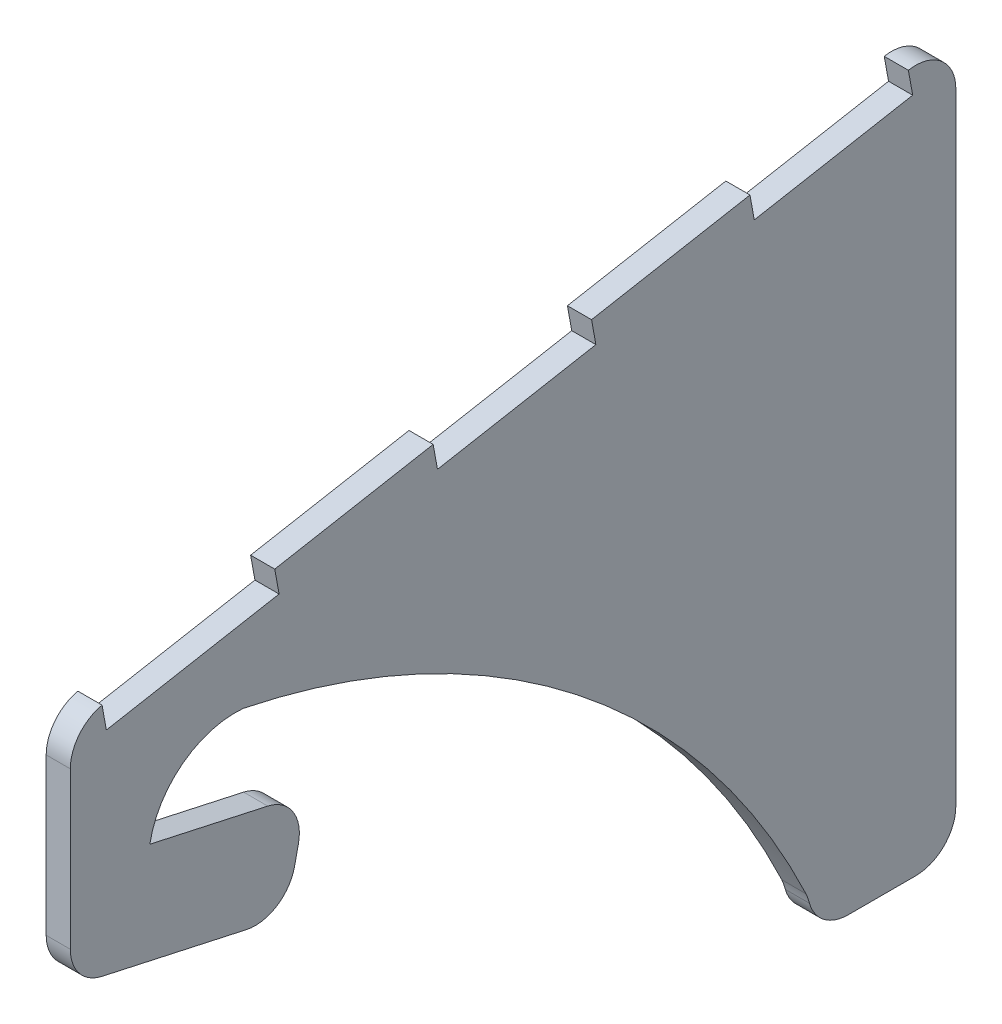
ISO-10303-21;
HEADER;
FILE_DESCRIPTION(('STEP AP214'),'2;1');
FILE_NAME('part.step','',(''),(''),'','','');
FILE_SCHEMA(('AUTOMOTIVE_DESIGN { 1 0 10303 214 1 1 1 1 }'));
ENDSEC;
DATA;
#1=APPLICATION_CONTEXT('core data for automotive mechanical design processes');
#2=APPLICATION_PROTOCOL_DEFINITION('international standard','automotive_design',2000,#1);
#3=PRODUCT_CONTEXT('',#1,'mechanical');
#4=PRODUCT('Part','Part','',(#3));
#5=PRODUCT_RELATED_PRODUCT_CATEGORY('part','',(#4));
#6=PRODUCT_DEFINITION_FORMATION('','',#4);
#7=PRODUCT_DEFINITION_CONTEXT('part definition',#1,'design');
#8=PRODUCT_DEFINITION('design','',#6,#7);
#9=PRODUCT_DEFINITION_SHAPE('','',#8);
#10=(LENGTH_UNIT() NAMED_UNIT(*) SI_UNIT(.MILLI.,.METRE.));
#11=(NAMED_UNIT(*) PLANE_ANGLE_UNIT() SI_UNIT($,.RADIAN.));
#12=(NAMED_UNIT(*) SI_UNIT($,.STERADIAN.) SOLID_ANGLE_UNIT());
#13=UNCERTAINTY_MEASURE_WITH_UNIT(LENGTH_MEASURE(1.E-05),#10,'distance_accuracy_value','');
#14=(GEOMETRIC_REPRESENTATION_CONTEXT(3) GLOBAL_UNCERTAINTY_ASSIGNED_CONTEXT((#13)) GLOBAL_UNIT_ASSIGNED_CONTEXT((#10,
#11,#12)) REPRESENTATION_CONTEXT('',''));
#15=CARTESIAN_POINT('',(0.,0.,0.));
#16=DIRECTION('',(0.,0.,1.));
#17=DIRECTION('',(1.,0.,0.));
#18=AXIS2_PLACEMENT_3D('',#15,#16,#17);
#19=CARTESIAN_POINT('',(-7.,-22.3926531414817,0.));
#20=DIRECTION('',(0.,-0.983869910099907,-0.178885438199983));
#21=DIRECTION('',(0.,0.178885438199983,-0.983869910099907));
#22=AXIS2_PLACEMENT_3D('',#19,#20,#21);
#23=PLANE('',#22);
#24=DIRECTION('',(0.,0.178885438199983,-0.983869910099907));
#25=VECTOR('',#24,1.);
#26=CARTESIAN_POINT('',(3.,-22.3926531414817,0.));
#27=LINE('',#26,#25);
#28=CARTESIAN_POINT('',(3.00000000000001,-10.6197847042083,-64.7507764050038));
#29=VERTEX_POINT('',#28);
#30=CARTESIAN_POINT('',(3.,-7.04207594020867,-84.4281746070019));
#31=VERTEX_POINT('',#30);
#32=EDGE_CURVE('E495',#29,#31,#27,.T.);
#33=ORIENTED_EDGE('',*,*,#32,.T.);
#34=DIRECTION('',(1.,0.,0.));
#35=VECTOR('',#34,1.);
#36=CARTESIAN_POINT('',(0.,-7.04207594020867,-84.4281746070019));
#37=LINE('',#36,#35);
#38=CARTESIAN_POINT('',(0.,-7.04207594020867,-84.4281746070019));
#39=VERTEX_POINT('',#38);
#40=EDGE_CURVE('E234',#39,#31,#37,.T.);
#41=ORIENTED_EDGE('',*,*,#40,.F.);
#42=DIRECTION('',(0.,0.178885438199983,-0.983869910099907));
#43=VECTOR('',#42,1.);
#44=CARTESIAN_POINT('',(0.,-21.6760882409543,-3.94110695290079));
#45=LINE('',#44,#43);
#46=CARTESIAN_POINT('',(0.,-10.6197847042083,-64.7507764050038));
#47=VERTEX_POINT('',#46);
#48=EDGE_CURVE('E240',#47,#39,#45,.T.);
#49=ORIENTED_EDGE('',*,*,#48,.F.);
#50=DIRECTION('',(-1.,0.,0.));
#51=VECTOR('',#50,1.);
#52=CARTESIAN_POINT('',(0.,-10.6197847042083,-64.7507764050038));
#53=LINE('',#52,#51);
#54=EDGE_CURVE('E253',#29,#47,#53,.T.);
#55=ORIENTED_EDGE('',*,*,#54,.F.);
#56=EDGE_LOOP('',(#33,#41,#49,#55));
#57=FACE_BOUND('',#56,.T.);
#58=ADVANCED_FACE('F37',(#57),#23,.F.);
#59=CARTESIAN_POINT('',(3.,0.,0.));
#60=DIRECTION('',(0.,0.,-1.));
#61=DIRECTION('',(0.,1.,0.));
#62=AXIS2_PLACEMENT_3D('',#59,#60,#61);
#63=PLANE('',#62);
#64=DIRECTION('',(0.,-1.,0.));
#65=VECTOR('',#64,1.);
#66=CARTESIAN_POINT('',(3.,0.,0.));
#67=LINE('',#66,#65);
#68=CARTESIAN_POINT('',(3.,-26.5655349085267,0.));
#69=VERTEX_POINT('',#68);
#70=CARTESIAN_POINT('',(3.,-45.9770603253843,0.));
#71=VERTEX_POINT('',#70);
#72=EDGE_CURVE('E369',#69,#71,#67,.T.);
#73=ORIENTED_EDGE('',*,*,#72,.F.);
#74=DIRECTION('',(1.,0.,0.));
#75=VECTOR('',#74,1.);
#76=CARTESIAN_POINT('',(3.,-26.5655349085267,0.));
#77=LINE('',#76,#75);
#78=CARTESIAN_POINT('',(0.,-26.5655349085267,0.));
#79=VERTEX_POINT('',#78);
#80=EDGE_CURVE('E45',#69,#79,#77,.F.);
#81=ORIENTED_EDGE('',*,*,#80,.T.);
#82=DIRECTION('',(0.,-1.,0.));
#83=VECTOR('',#82,1.);
#84=CARTESIAN_POINT('',(0.,0.,0.));
#85=LINE('',#84,#83);
#86=CARTESIAN_POINT('',(0.,-45.9770603253843,0.));
#87=VERTEX_POINT('',#86);
#88=EDGE_CURVE('E364',#79,#87,#85,.T.);
#89=ORIENTED_EDGE('',*,*,#88,.T.);
#90=DIRECTION('',(1.,0.,0.));
#91=VECTOR('',#90,1.);
#92=CARTESIAN_POINT('',(3.,-45.9770603253843,0.));
#93=LINE('',#92,#91);
#94=EDGE_CURVE('E411',#87,#71,#93,.T.);
#95=ORIENTED_EDGE('',*,*,#94,.T.);
#96=EDGE_LOOP('',(#73,#81,#89,#95));
#97=FACE_BOUND('',#96,.T.);
#98=ADVANCED_FACE('F410',(#97),#63,.F.);
#99=CARTESIAN_POINT('',(3.,0.,-110.));
#100=DIRECTION('',(0.,0.,1.));
#101=DIRECTION('',(0.,-1.,0.));
#102=AXIS2_PLACEMENT_3D('',#99,#100,#101);
#103=PLANE('',#102);
#104=DIRECTION('',(0.,1.,0.));
#105=VECTOR('',#104,1.);
#106=CARTESIAN_POINT('',(0.,0.,-110.));
#107=LINE('',#106,#105);
#108=CARTESIAN_POINT('',(0.,-85.5863037175349,-110.));
#109=VERTEX_POINT('',#108);
#110=CARTESIAN_POINT('',(0.,-8.38371672670854,-110.));
#111=VERTEX_POINT('',#110);
#112=EDGE_CURVE('E374',#109,#111,#107,.T.);
#113=ORIENTED_EDGE('',*,*,#112,.T.);
#114=DIRECTION('',(1.,0.,0.));
#115=VECTOR('',#114,1.);
#116=CARTESIAN_POINT('',(3.,-8.38371672670854,-110.));
#117=LINE('',#116,#115);
#118=CARTESIAN_POINT('',(3.,-8.38371672670854,-110.));
#119=VERTEX_POINT('',#118);
#120=EDGE_CURVE('E431',#111,#119,#117,.T.);
#121=ORIENTED_EDGE('',*,*,#120,.T.);
#122=DIRECTION('',(0.,1.,0.));
#123=VECTOR('',#122,1.);
#124=CARTESIAN_POINT('',(3.,0.,-110.));
#125=LINE('',#124,#123);
#126=CARTESIAN_POINT('',(3.,-85.5863037175349,-110.));
#127=VERTEX_POINT('',#126);
#128=EDGE_CURVE('E373',#127,#119,#125,.T.);
#129=ORIENTED_EDGE('',*,*,#128,.F.);
#130=DIRECTION('',(1.,0.,0.));
#131=VECTOR('',#130,1.);
#132=CARTESIAN_POINT('',(3.,-85.5863037175349,-110.));
#133=LINE('',#132,#131);
#134=EDGE_CURVE('E434',#127,#109,#133,.F.);
#135=ORIENTED_EDGE('',*,*,#134,.T.);
#136=EDGE_LOOP('',(#113,#121,#129,#135));
#137=FACE_BOUND('',#136,.T.);
#138=ADVANCED_FACE('F592',(#137),#103,.F.);
#139=CARTESIAN_POINT('',(3.,0.,0.));
#140=DIRECTION('',(1.,0.,0.));
#141=DIRECTION('',(0.,0.,-1.));
#142=AXIS2_PLACEMENT_3D('',#139,#140,#141);
#143=PLANE('',#142);
#144=DIRECTION('',(0.,0.983869910099907,0.178885438199983));
#145=VECTOR('',#144,1.);
#146=CARTESIAN_POINT('',(3.,-6.41597690650873,-104.6422291236));
#147=LINE('',#146,#145);
#148=CARTESIAN_POINT('',(3.,-6.41597690650873,-104.6422291236));
#149=VERTEX_POINT('',#148);
#150=CARTESIAN_POINT('',(3.,-3.46436717620901,-104.105572809));
#151=VERTEX_POINT('',#150);
#152=EDGE_CURVE('E243',#149,#151,#147,.T.);
#153=ORIENTED_EDGE('',*,*,#152,.F.);
#154=DIRECTION('',(0.,0.178885438199983,-0.983869910099908));
#155=VECTOR('',#154,1.);
#156=CARTESIAN_POINT('',(3.,-6.41597690650873,-104.6422291236));
#157=LINE('',#156,#155);
#158=CARTESIAN_POINT('',(3.,-9.9936856705084,-84.9648309216019));
#159=VERTEX_POINT('',#158);
#160=EDGE_CURVE('E224',#159,#149,#157,.T.);
#161=ORIENTED_EDGE('',*,*,#160,.F.);
#162=DIRECTION('',(0.,0.983869910099907,0.178885438199983));
#163=VECTOR('',#162,1.);
#164=CARTESIAN_POINT('',(3.,-9.9936856705084,-84.9648309216019));
#165=LINE('',#164,#163);
#166=EDGE_CURVE('E221',#159,#31,#165,.T.);
#167=ORIENTED_EDGE('',*,*,#166,.T.);
#168=ORIENTED_EDGE('',*,*,#32,.F.);
#169=DIRECTION('',(0.,0.983869910099907,0.178885438199983));
#170=VECTOR('',#169,1.);
#171=CARTESIAN_POINT('',(3.00000000000001,-13.5713944345081,-65.2874327196037));
#172=LINE('',#171,#170);
#173=CARTESIAN_POINT('',(3.00000000000001,-13.5713944345081,-65.2874327196037));
#174=VERTEX_POINT('',#173);
#175=EDGE_CURVE('E276',#174,#29,#172,.T.);
#176=ORIENTED_EDGE('',*,*,#175,.F.);
#177=DIRECTION('',(0.,0.178885438199983,-0.983869910099908));
#178=VECTOR('',#177,1.);
#179=CARTESIAN_POINT('',(3.00000000000001,-13.5713944345081,-65.2874327196037));
#180=LINE('',#179,#178);
#181=CARTESIAN_POINT('',(3.00000000000001,-17.1491031985077,-45.6100345176056));
#182=VERTEX_POINT('',#181);
#183=EDGE_CURVE('E256',#182,#174,#180,.T.);
#184=ORIENTED_EDGE('',*,*,#183,.F.);
#185=DIRECTION('',(0.,0.983869910099907,0.178885438199983));
#186=VECTOR('',#185,1.);
#187=CARTESIAN_POINT('',(3.00000000000001,-17.1491031985077,-45.6100345176056));
#188=LINE('',#187,#186);
#189=CARTESIAN_POINT('',(3.00000000000001,-14.197493468208,-45.0733782030056));
#190=VERTEX_POINT('',#189);
#191=EDGE_CURVE('E271',#182,#190,#188,.T.);
#192=ORIENTED_EDGE('',*,*,#191,.T.);
#193=CARTESIAN_POINT('',(3.00000000000002,-17.7752022322077,-25.3959800010075));
#194=VERTEX_POINT('',#193);
#195=EDGE_CURVE('E488',#194,#190,#27,.T.);
#196=ORIENTED_EDGE('',*,*,#195,.F.);
#197=DIRECTION('',(0.,0.983869910099907,0.178885438199983));
#198=VECTOR('',#197,1.);
#199=CARTESIAN_POINT('',(3.00000000000002,-20.7268119625074,-25.9326363156074));
#200=LINE('',#199,#198);
#201=CARTESIAN_POINT('',(3.00000000000002,-20.7268119625074,-25.9326363156074));
#202=VERTEX_POINT('',#201);
#203=EDGE_CURVE('E305',#202,#194,#200,.T.);
#204=ORIENTED_EDGE('',*,*,#203,.F.);
#205=DIRECTION('',(0.,0.178885438199983,-0.983869910099907));
#206=VECTOR('',#205,1.);
#207=CARTESIAN_POINT('',(3.,-24.6276979712541,-4.47776326750073));
#208=LINE('',#207,#206);
#209=CARTESIAN_POINT('',(3.,-24.6276979712541,-4.47776326750073));
#210=VERTEX_POINT('',#209);
#211=EDGE_CURVE('E287',#210,#202,#208,.T.);
#212=ORIENTED_EDGE('',*,*,#211,.F.);
#213=DIRECTION('',(0.,0.983869910099907,0.178885438199983));
#214=VECTOR('',#213,1.);
#215=CARTESIAN_POINT('',(3.,-24.6276979712541,-4.47776326750073));
#216=LINE('',#215,#214);
#217=CARTESIAN_POINT('',(3.,-21.6788382570015,-3.94160695581845));
#218=VERTEX_POINT('',#217);
#219=EDGE_CURVE('E300',#210,#218,#216,.T.);
#220=ORIENTED_EDGE('',*,*,#219,.T.);
#221=CARTESIAN_POINT('',(3.,-26.5655349085267,-5.));
#222=DIRECTION('',(1.,0.,0.));
#223=DIRECTION('',(0.,0.,-1.));
#224=AXIS2_PLACEMENT_3D('',#221,#222,#223);
#225=CIRCLE('',#224,5.);
#226=EDGE_CURVE('E328',#218,#69,#225,.T.);
#227=ORIENTED_EDGE('',*,*,#226,.T.);
#228=ORIENTED_EDGE('',*,*,#72,.T.);
#229=CARTESIAN_POINT('',(3.,-45.9770603253843,-5.00000000000001));
#230=DIRECTION('',(1.,0.,0.));
#231=DIRECTION('',(0.,0.,-1.));
#232=AXIS2_PLACEMENT_3D('',#229,#230,#231);
#233=CIRCLE('',#232,5.);
#234=CARTESIAN_POINT('',(3.,-50.8605717362818,-3.92700591817357));
#235=VERTEX_POINT('',#234);
#236=EDGE_CURVE('E377',#71,#235,#233,.T.);
#237=ORIENTED_EDGE('',*,*,#236,.T.);
#238=DIRECTION('',(0.,0.214598816365285,0.976702282179487));
#239=VECTOR('',#238,1.);
#240=CARTESIAN_POINT('',(3.,-55.8815219799871,-26.7788260949877));
#241=LINE('',#240,#239);
#242=CARTESIAN_POINT('',(3.,-54.8085278981607,-21.8953146840903));
#243=VERTEX_POINT('',#242);
#244=EDGE_CURVE('E530',#243,#235,#241,.T.);
#245=ORIENTED_EDGE('',*,*,#244,.F.);
#246=CARTESIAN_POINT('',(3.,-49.9250164872633,-22.9683087659167));
#247=DIRECTION('',(1.,0.,0.));
#248=DIRECTION('',(0.,0.,-1.));
#249=AXIS2_PLACEMENT_3D('',#246,#247,#248);
#250=CIRCLE('',#249,5.);
#251=CARTESIAN_POINT('',(3.,-50.9980105690897,-27.8518201768142));
#252=VERTEX_POINT('',#251);
#253=EDGE_CURVE('E338',#243,#252,#250,.T.);
#254=ORIENTED_EDGE('',*,*,#253,.T.);
#255=DIRECTION('',(0.,-0.976702282179487,0.214598816365285));
#256=VECTOR('',#255,1.);
#257=CARTESIAN_POINT('',(3.,-55.8815219799871,-26.7788260949877));
#258=LINE('',#257,#256);
#259=CARTESIAN_POINT('',(3.,-48.7905220180035,-28.3368445684291));
#260=VERTEX_POINT('',#259);
#261=EDGE_CURVE('E352',#260,#252,#258,.T.);
#262=ORIENTED_EDGE('',*,*,#261,.F.);
#263=CARTESIAN_POINT('',(3.,-47.7175279361771,-23.4533331575316));
#264=DIRECTION('',(1.,0.,0.));
#265=DIRECTION('',(0.,0.,-1.));
#266=AXIS2_PLACEMENT_3D('',#263,#264,#265);
#267=CIRCLE('',#266,5.);
#268=CARTESIAN_POINT('',(3.,-42.8340165252797,-24.5263272393581));
#269=VERTEX_POINT('',#268);
#270=EDGE_CURVE('E342',#260,#269,#267,.T.);
#271=ORIENTED_EDGE('',*,*,#270,.T.);
#272=DIRECTION('',(0.,-0.214598816365284,-0.976702282179487));
#273=VECTOR('',#272,1.);
#274=CARTESIAN_POINT('',(3.,-43.9070106071061,-29.4098386502555));
#275=LINE('',#274,#273);
#276=CARTESIAN_POINT('',(3.,-39.6150342798004,-9.87579300666575));
#277=VERTEX_POINT('',#276);
#278=EDGE_CURVE('E359',#277,#269,#275,.T.);
#279=ORIENTED_EDGE('',*,*,#278,.F.);
#280=CARTESIAN_POINT('',(3.,-41.5550997872941,-20.4960774024267));
#281=DIRECTION('',(1.,0.,0.));
#282=DIRECTION('',(0.,0.,1.));
#283=AXIS2_PLACEMENT_3D('',#280,#281,#282);
#284=CIRCLE('',#283,10.7960314384598);
#285=CARTESIAN_POINT('',(3.,-30.8058561303711,-21.5000971354558));
#286=VERTEX_POINT('',#285);
#287=EDGE_CURVE('E469',#286,#277,#284,.T.);
#288=ORIENTED_EDGE('',*,*,#287,.F.);
#289=CARTESIAN_POINT('',(3.,-128.43143591588,-1.32019027755404));
#290=DIRECTION('',(1.,0.,0.));
#291=DIRECTION('',(0.,0.,1.));
#292=AXIS2_PLACEMENT_3D('',#289,#290,#291);
#293=CIRCLE('',#292,99.6894300778688);
#294=CARTESIAN_POINT('',(3.,-85.6960409404609,-91.3849918681046));
#295=VERTEX_POINT('',#294);
#296=EDGE_CURVE('E491',#295,#286,#293,.T.);
#297=ORIENTED_EDGE('',*,*,#296,.F.);
#298=CARTESIAN_POINT('',(3.,-89.8691166200246,-81.4207304169609));
#299=DIRECTION('',(1.,0.,0.));
#300=DIRECTION('',(0.,0.,1.));
#301=AXIS2_PLACEMENT_3D('',#298,#299,#300);
#302=CIRCLE('',#301,10.8028268010792);
#303=CARTESIAN_POINT('',(3.,-86.9413818172952,-91.8192608813584));
#304=VERTEX_POINT('',#303);
#305=EDGE_CURVE('E487',#304,#295,#302,.T.);
#306=ORIENTED_EDGE('',*,*,#305,.F.);
#307=CARTESIAN_POINT('',(3.,-85.5863037175349,-96.6321356297338));
#308=DIRECTION('',(1.,0.,0.));
#309=DIRECTION('',(0.,0.,-1.));
#310=AXIS2_PLACEMENT_3D('',#307,#308,#309);
#311=CIRCLE('',#310,5.);
#312=CARTESIAN_POINT('',(3.,-90.5863037175349,-96.6321356297338));
#313=VERTEX_POINT('',#312);
#314=EDGE_CURVE('E327',#304,#313,#311,.T.);
#315=ORIENTED_EDGE('',*,*,#314,.T.);
#316=DIRECTION('',(0.,0.,1.));
#317=VECTOR('',#316,1.);
#318=CARTESIAN_POINT('',(3.,-90.5863037175349,-92.199724319978));
#319=LINE('',#318,#317);
#320=CARTESIAN_POINT('',(3.,-90.5863037175349,-105.));
#321=VERTEX_POINT('',#320);
#322=EDGE_CURVE('E309',#321,#313,#319,.T.);
#323=ORIENTED_EDGE('',*,*,#322,.F.);
#324=CARTESIAN_POINT('',(3.,-85.5863037175349,-105.));
#325=DIRECTION('',(1.,0.,0.));
#326=DIRECTION('',(0.,0.,-1.));
#327=AXIS2_PLACEMENT_3D('',#324,#325,#326);
#328=CIRCLE('',#327,5.);
#329=EDGE_CURVE('E324',#321,#127,#328,.T.);
#330=ORIENTED_EDGE('',*,*,#329,.T.);
#331=ORIENTED_EDGE('',*,*,#128,.T.);
#332=CARTESIAN_POINT('',(3.,-8.38371672670854,-105.));
#333=DIRECTION('',(1.,0.,0.));
#334=DIRECTION('',(0.,0.,-1.));
#335=AXIS2_PLACEMENT_3D('',#332,#333,#334);
#336=CIRCLE('',#335,5.);
#337=EDGE_CURVE('E333',#119,#151,#336,.T.);
#338=ORIENTED_EDGE('',*,*,#337,.T.);
#339=EDGE_LOOP('',(#153,#161,#167,#168,#176,#184,#192,#196,#204,#212,#220,#227,#228,#237,#245,
#254,#262,#271,#279,#288,#297,#306,#315,#323,#330,#331,#338));
#340=FACE_BOUND('',#339,.T.);
#341=ADVANCED_FACE('F462',(#340),#143,.T.);
#342=CARTESIAN_POINT('',(0.,0.,0.));
#343=DIRECTION('',(1.,0.,0.));
#344=DIRECTION('',(0.,0.,-1.));
#345=AXIS2_PLACEMENT_3D('',#342,#343,#344);
#346=PLANE('',#345);
#347=DIRECTION('',(0.,-0.178885438199983,0.983869910099908));
#348=VECTOR('',#347,1.);
#349=CARTESIAN_POINT('',(0.,-6.41597690650873,-104.6422291236));
#350=LINE('',#349,#348);
#351=CARTESIAN_POINT('',(0.,-6.41597690650873,-104.6422291236));
#352=VERTEX_POINT('',#351);
#353=CARTESIAN_POINT('',(0.,-9.9936856705084,-84.9648309216019));
#354=VERTEX_POINT('',#353);
#355=EDGE_CURVE('E225',#352,#354,#350,.T.);
#356=ORIENTED_EDGE('',*,*,#355,.F.);
#357=DIRECTION('',(0.,0.983869910099907,0.178885438199983));
#358=VECTOR('',#357,1.);
#359=CARTESIAN_POINT('',(0.,-6.41597690650873,-104.6422291236));
#360=LINE('',#359,#358);
#361=CARTESIAN_POINT('',(0.,-3.46436717620901,-104.105572809));
#362=VERTEX_POINT('',#361);
#363=EDGE_CURVE('E315',#352,#362,#360,.T.);
#364=ORIENTED_EDGE('',*,*,#363,.T.);
#365=CARTESIAN_POINT('',(0.,-8.38371672670854,-105.));
#366=DIRECTION('',(1.,0.,0.));
#367=DIRECTION('',(0.,0.,-1.));
#368=AXIS2_PLACEMENT_3D('',#365,#366,#367);
#369=CIRCLE('',#368,5.);
#370=EDGE_CURVE('E444',#362,#111,#369,.F.);
#371=ORIENTED_EDGE('',*,*,#370,.T.);
#372=ORIENTED_EDGE('',*,*,#112,.F.);
#373=CARTESIAN_POINT('',(0.,-85.5863037175349,-105.));
#374=DIRECTION('',(1.,0.,0.));
#375=DIRECTION('',(0.,0.,-1.));
#376=AXIS2_PLACEMENT_3D('',#373,#374,#375);
#377=CIRCLE('',#376,5.);
#378=CARTESIAN_POINT('',(0.,-90.5863037175349,-105.));
#379=VERTEX_POINT('',#378);
#380=EDGE_CURVE('E448',#109,#379,#377,.F.);
#381=ORIENTED_EDGE('',*,*,#380,.T.);
#382=DIRECTION('',(0.,0.,1.));
#383=VECTOR('',#382,1.);
#384=CARTESIAN_POINT('',(0.,-90.5863037175349,0.));
#385=LINE('',#384,#383);
#386=CARTESIAN_POINT('',(0.,-90.5863037175349,-96.6321356297338));
#387=VERTEX_POINT('',#386);
#388=EDGE_CURVE('E314',#379,#387,#385,.T.);
#389=ORIENTED_EDGE('',*,*,#388,.T.);
#390=CARTESIAN_POINT('',(0.,-85.5863037175349,-96.6321356297338));
#391=DIRECTION('',(1.,0.,0.));
#392=DIRECTION('',(0.,0.,-1.));
#393=AXIS2_PLACEMENT_3D('',#390,#391,#392);
#394=CIRCLE('',#393,5.);
#395=CARTESIAN_POINT('',(0.,-86.9413818172952,-91.8192608813584));
#396=VERTEX_POINT('',#395);
#397=EDGE_CURVE('E446',#387,#396,#394,.F.);
#398=ORIENTED_EDGE('',*,*,#397,.T.);
#399=CARTESIAN_POINT('',(0.,-89.8691166200246,-81.4207304169609));
#400=DIRECTION('',(1.,0.,0.));
#401=DIRECTION('',(0.,0.,-1.));
#402=AXIS2_PLACEMENT_3D('',#399,#400,#401);
#403=CIRCLE('',#402,10.8028268010792);
#404=CARTESIAN_POINT('',(0.,-85.6960409404609,-91.3849918681046));
#405=VERTEX_POINT('',#404);
#406=EDGE_CURVE('E389',#396,#405,#403,.T.);
#407=ORIENTED_EDGE('',*,*,#406,.T.);
#408=CARTESIAN_POINT('',(0.,-128.43143591588,-1.32019027755404));
#409=DIRECTION('',(1.,0.,0.));
#410=DIRECTION('',(0.,0.,-1.));
#411=AXIS2_PLACEMENT_3D('',#408,#409,#410);
#412=CIRCLE('',#411,99.6894300778688);
#413=CARTESIAN_POINT('',(0.,-30.8058561303711,-21.5000971354558));
#414=VERTEX_POINT('',#413);
#415=EDGE_CURVE('E391',#405,#414,#412,.T.);
#416=ORIENTED_EDGE('',*,*,#415,.T.);
#417=CARTESIAN_POINT('',(0.,-41.5550997872941,-20.4960774024267));
#418=DIRECTION('',(1.,0.,0.));
#419=DIRECTION('',(0.,0.,-1.));
#420=AXIS2_PLACEMENT_3D('',#417,#418,#419);
#421=CIRCLE('',#420,10.7960314384598);
#422=CARTESIAN_POINT('',(0.,-39.6150342798004,-9.87579300666575));
#423=VERTEX_POINT('',#422);
#424=EDGE_CURVE('E394',#414,#423,#421,.T.);
#425=ORIENTED_EDGE('',*,*,#424,.T.);
#426=DIRECTION('',(0.,-0.214598816365284,-0.976702282179487));
#427=VECTOR('',#426,1.);
#428=CARTESIAN_POINT('',(0.,-35.72069903644,7.84847120030777));
#429=LINE('',#428,#427);
#430=CARTESIAN_POINT('',(0.,-42.8340165252797,-24.5263272393581));
#431=VERTEX_POINT('',#430);
#432=EDGE_CURVE('E397',#423,#431,#429,.T.);
#433=ORIENTED_EDGE('',*,*,#432,.T.);
#434=CARTESIAN_POINT('',(0.,-47.7175279361771,-23.4533331575316));
#435=DIRECTION('',(1.,0.,0.));
#436=DIRECTION('',(0.,0.,-1.));
#437=AXIS2_PLACEMENT_3D('',#434,#435,#436);
#438=CIRCLE('',#437,5.);
#439=CARTESIAN_POINT('',(0.,-48.7905220180035,-28.3368445684291));
#440=VERTEX_POINT('',#439);
#441=EDGE_CURVE('E440',#431,#440,#438,.F.);
#442=ORIENTED_EDGE('',*,*,#441,.T.);
#443=DIRECTION('',(0.,-0.976702282179487,0.214598816365285));
#444=VECTOR('',#443,1.);
#445=CARTESIAN_POINT('',(0.,-8.1863115706661,-37.2583098505633));
#446=LINE('',#445,#444);
#447=CARTESIAN_POINT('',(0.,-50.9980105690897,-27.8518201768142));
#448=VERTEX_POINT('',#447);
#449=EDGE_CURVE('E400',#440,#448,#446,.T.);
#450=ORIENTED_EDGE('',*,*,#449,.T.);
#451=CARTESIAN_POINT('',(0.,-49.9250164872633,-22.9683087659167));
#452=DIRECTION('',(1.,0.,0.));
#453=DIRECTION('',(0.,0.,-1.));
#454=AXIS2_PLACEMENT_3D('',#451,#452,#453);
#455=CIRCLE('',#454,5.);
#456=CARTESIAN_POINT('',(0.,-54.8085278981607,-21.8953146840903));
#457=VERTEX_POINT('',#456);
#458=EDGE_CURVE('E442',#448,#457,#455,.F.);
#459=ORIENTED_EDGE('',*,*,#458,.T.);
#460=DIRECTION('',(0.,0.214598816365285,0.976702282179487));
#461=VECTOR('',#460,1.);
#462=CARTESIAN_POINT('',(0.,-47.695210409321,10.4794837555756));
#463=LINE('',#462,#461);
#464=CARTESIAN_POINT('',(0.,-50.8605717362818,-3.92700591817359));
#465=VERTEX_POINT('',#464);
#466=EDGE_CURVE('E482',#457,#465,#463,.T.);
#467=ORIENTED_EDGE('',*,*,#466,.T.);
#468=CARTESIAN_POINT('',(0.,-45.9770603253843,-5.00000000000001));
#469=DIRECTION('',(1.,0.,0.));
#470=DIRECTION('',(0.,0.,-1.));
#471=AXIS2_PLACEMENT_3D('',#468,#469,#470);
#472=CIRCLE('',#471,5.);
#473=EDGE_CURVE('E418',#465,#87,#472,.F.);
#474=ORIENTED_EDGE('',*,*,#473,.T.);
#475=ORIENTED_EDGE('',*,*,#88,.F.);
#476=CARTESIAN_POINT('',(0.,-26.5655349085267,-5.));
#477=DIRECTION('',(1.,0.,0.));
#478=DIRECTION('',(0.,0.,-1.));
#479=AXIS2_PLACEMENT_3D('',#476,#477,#478);
#480=CIRCLE('',#479,5.);
#481=CARTESIAN_POINT('',(0.,-21.6788382570015,-3.94160695581845));
#482=VERTEX_POINT('',#481);
#483=EDGE_CURVE('E450',#79,#482,#480,.F.);
#484=ORIENTED_EDGE('',*,*,#483,.T.);
#485=DIRECTION('',(0.,0.983869910099907,0.178885438199983));
#486=VECTOR('',#485,1.);
#487=CARTESIAN_POINT('',(0.,-24.6276979712541,-4.47776326750073));
#488=LINE('',#487,#486);
#489=CARTESIAN_POINT('',(0.,-24.6276979712541,-4.47776326750073));
#490=VERTEX_POINT('',#489);
#491=EDGE_CURVE('E59',#490,#482,#488,.T.);
#492=ORIENTED_EDGE('',*,*,#491,.F.);
#493=DIRECTION('',(0.,-0.178885438199983,0.983869910099907));
#494=VECTOR('',#493,1.);
#495=CARTESIAN_POINT('',(0.,-24.6276979712541,-4.47776326750073));
#496=LINE('',#495,#494);
#497=CARTESIAN_POINT('',(0.,-20.7268119625074,-25.9326363156074));
#498=VERTEX_POINT('',#497);
#499=EDGE_CURVE('E280',#498,#490,#496,.T.);
#500=ORIENTED_EDGE('',*,*,#499,.F.);
#501=DIRECTION('',(0.,0.983869910099907,0.178885438199983));
#502=VECTOR('',#501,1.);
#503=CARTESIAN_POINT('',(0.,-20.7268119625074,-25.9326363156074));
#504=LINE('',#503,#502);
#505=CARTESIAN_POINT('',(0.,-17.7752022322077,-25.3959800010075));
#506=VERTEX_POINT('',#505);
#507=EDGE_CURVE('E555',#498,#506,#504,.T.);
#508=ORIENTED_EDGE('',*,*,#507,.T.);
#509=CARTESIAN_POINT('',(0.,-14.197493468208,-45.0733782030056));
#510=VERTEX_POINT('',#509);
#511=EDGE_CURVE('E387',#506,#510,#45,.T.);
#512=ORIENTED_EDGE('',*,*,#511,.T.);
#513=DIRECTION('',(0.,0.983869910099907,0.178885438199983));
#514=VECTOR('',#513,1.);
#515=CARTESIAN_POINT('',(0.,-17.1491031985077,-45.6100345176056));
#516=LINE('',#515,#514);
#517=CARTESIAN_POINT('',(0.,-17.1491031985077,-45.6100345176056));
#518=VERTEX_POINT('',#517);
#519=EDGE_CURVE('E52',#518,#510,#516,.T.);
#520=ORIENTED_EDGE('',*,*,#519,.F.);
#521=DIRECTION('',(0.,-0.178885438199983,0.983869910099908));
#522=VECTOR('',#521,1.);
#523=CARTESIAN_POINT('',(0.,-13.5713944345081,-65.2874327196037));
#524=LINE('',#523,#522);
#525=CARTESIAN_POINT('',(0.,-13.5713944345081,-65.2874327196037));
#526=VERTEX_POINT('',#525);
#527=EDGE_CURVE('E249',#526,#518,#524,.T.);
#528=ORIENTED_EDGE('',*,*,#527,.F.);
#529=DIRECTION('',(0.,0.983869910099907,0.178885438199983));
#530=VECTOR('',#529,1.);
#531=CARTESIAN_POINT('',(0.,-13.5713944345081,-65.2874327196037));
#532=LINE('',#531,#530);
#533=EDGE_CURVE('E551',#526,#47,#532,.T.);
#534=ORIENTED_EDGE('',*,*,#533,.T.);
#535=ORIENTED_EDGE('',*,*,#48,.T.);
#536=DIRECTION('',(0.,0.983869910099907,0.178885438199983));
#537=VECTOR('',#536,1.);
#538=CARTESIAN_POINT('',(0.,-9.9936856705084,-84.9648309216019));
#539=LINE('',#538,#537);
#540=EDGE_CURVE('E218',#354,#39,#539,.T.);
#541=ORIENTED_EDGE('',*,*,#540,.F.);
#542=EDGE_LOOP('',(#356,#364,#371,#372,#381,#389,#398,#407,#416,#425,#433,#442,#450,#459,#467,
#474,#475,#484,#492,#500,#508,#512,#520,#528,#534,#535,#541));
#543=FACE_BOUND('',#542,.T.);
#544=ADVANCED_FACE('F237',(#543),#346,.F.);
#545=CARTESIAN_POINT('',(-7.,-55.8815219799871,-26.7788260949877));
#546=DIRECTION('',(0.,0.214598816365285,0.976702282179487));
#547=DIRECTION('',(0.,-0.976702282179487,0.214598816365285));
#548=AXIS2_PLACEMENT_3D('',#545,#546,#547);
#549=PLANE('',#548);
#550=ORIENTED_EDGE('',*,*,#449,.F.);
#551=DIRECTION('',(1.,0.,0.));
#552=VECTOR('',#551,1.);
#553=CARTESIAN_POINT('',(-7.,-48.7905220180035,-28.3368445684291));
#554=LINE('',#553,#552);
#555=EDGE_CURVE('E381',#440,#260,#554,.T.);
#556=ORIENTED_EDGE('',*,*,#555,.T.);
#557=ORIENTED_EDGE('',*,*,#261,.T.);
#558=DIRECTION('',(-1.,0.,0.));
#559=VECTOR('',#558,1.);
#560=CARTESIAN_POINT('',(-7.,-50.9980105690897,-27.8518201768142));
#561=LINE('',#560,#559);
#562=EDGE_CURVE('E384',#252,#448,#561,.T.);
#563=ORIENTED_EDGE('',*,*,#562,.T.);
#564=EDGE_LOOP('',(#550,#556,#557,#563));
#565=FACE_BOUND('',#564,.T.);
#566=ADVANCED_FACE('F474',(#565),#549,.F.);
#567=CARTESIAN_POINT('',(-7.,-43.9070106071061,-29.4098386502555));
#568=DIRECTION('',(0.,-0.976702282179487,0.214598816365284));
#569=DIRECTION('',(0.,-0.214598816365284,-0.976702282179487));
#570=AXIS2_PLACEMENT_3D('',#567,#568,#569);
#571=PLANE('',#570);
#572=ORIENTED_EDGE('',*,*,#278,.T.);
#573=DIRECTION('',(1.,0.,0.));
#574=VECTOR('',#573,1.);
#575=CARTESIAN_POINT('',(-7.,-42.8340165252797,-24.5263272393581));
#576=LINE('',#575,#574);
#577=EDGE_CURVE('E452',#269,#431,#576,.F.);
#578=ORIENTED_EDGE('',*,*,#577,.T.);
#579=ORIENTED_EDGE('',*,*,#432,.F.);
#580=DIRECTION('',(1.,0.,0.));
#581=VECTOR('',#580,1.);
#582=CARTESIAN_POINT('',(-7.,-39.6150342798004,-9.87579300666575));
#583=LINE('',#582,#581);
#584=EDGE_CURVE('E362',#423,#277,#583,.T.);
#585=ORIENTED_EDGE('',*,*,#584,.T.);
#586=EDGE_LOOP('',(#572,#578,#579,#585));
#587=FACE_BOUND('',#586,.T.);
#588=ADVANCED_FACE('F466',(#587),#571,.F.);
#589=CARTESIAN_POINT('',(-7.,-41.5550997872941,-20.4960774024267));
#590=DIRECTION('',(1.,0.,0.));
#591=DIRECTION('',(0.,0.,-1.));
#592=AXIS2_PLACEMENT_3D('',#589,#590,#591);
#593=CYLINDRICAL_SURFACE('',#592,10.7960314384598);
#594=DIRECTION('',(1.,0.,0.));
#595=VECTOR('',#594,1.);
#596=CARTESIAN_POINT('',(-7.,-30.8058561303711,-21.5000971354558));
#597=LINE('',#596,#595);
#598=EDGE_CURVE('E365',#414,#286,#597,.T.);
#599=ORIENTED_EDGE('',*,*,#598,.T.);
#600=ORIENTED_EDGE('',*,*,#287,.T.);
#601=ORIENTED_EDGE('',*,*,#584,.F.);
#602=ORIENTED_EDGE('',*,*,#424,.F.);
#603=EDGE_LOOP('',(#599,#600,#601,#602));
#604=FACE_BOUND('',#603,.T.);
#605=ADVANCED_FACE('F610',(#604),#593,.F.);
#606=CARTESIAN_POINT('',(-7.,-128.43143591588,-1.32019027755404));
#607=DIRECTION('',(1.,0.,0.));
#608=DIRECTION('',(0.,0.,-1.));
#609=AXIS2_PLACEMENT_3D('',#606,#607,#608);
#610=CYLINDRICAL_SURFACE('',#609,99.6894300778688);
#611=DIRECTION('',(1.,0.,0.));
#612=VECTOR('',#611,1.);
#613=CARTESIAN_POINT('',(-7.,-85.6960409404609,-91.3849918681046));
#614=LINE('',#613,#612);
#615=EDGE_CURVE('E358',#405,#295,#614,.T.);
#616=ORIENTED_EDGE('',*,*,#615,.T.);
#617=ORIENTED_EDGE('',*,*,#296,.T.);
#618=ORIENTED_EDGE('',*,*,#598,.F.);
#619=ORIENTED_EDGE('',*,*,#415,.F.);
#620=EDGE_LOOP('',(#616,#617,#618,#619));
#621=FACE_BOUND('',#620,.T.);
#622=ADVANCED_FACE('F510',(#621),#610,.F.);
#623=CARTESIAN_POINT('',(-7.,-89.8691166200246,-81.4207304169609));
#624=DIRECTION('',(1.,0.,0.));
#625=DIRECTION('',(0.,0.,-1.));
#626=AXIS2_PLACEMENT_3D('',#623,#624,#625);
#627=CYLINDRICAL_SURFACE('',#626,10.8028268010792);
#628=ORIENTED_EDGE('',*,*,#406,.F.);
#629=DIRECTION('',(1.,0.,0.));
#630=VECTOR('',#629,1.);
#631=CARTESIAN_POINT('',(-7.,-86.9413818172952,-91.8192608813584));
#632=LINE('',#631,#630);
#633=EDGE_CURVE('E426',#396,#304,#632,.T.);
#634=ORIENTED_EDGE('',*,*,#633,.T.);
#635=ORIENTED_EDGE('',*,*,#305,.T.);
#636=ORIENTED_EDGE('',*,*,#615,.F.);
#637=EDGE_LOOP('',(#628,#634,#635,#636));
#638=FACE_BOUND('',#637,.T.);
#639=ADVANCED_FACE('F517',(#638),#627,.F.);
#640=CARTESIAN_POINT('',(-7.,-55.8815219799871,-26.7788260949877));
#641=DIRECTION('',(0.,0.976702282179487,-0.214598816365285));
#642=DIRECTION('',(0.,0.214598816365285,0.976702282179487));
#643=AXIS2_PLACEMENT_3D('',#640,#641,#642);
#644=PLANE('',#643);
#645=ORIENTED_EDGE('',*,*,#466,.F.);
#646=DIRECTION('',(-1.,0.,0.));
#647=VECTOR('',#646,1.);
#648=CARTESIAN_POINT('',(-7.,-54.8085278981607,-21.8953146840903));
#649=LINE('',#648,#647);
#650=EDGE_CURVE('E436',#457,#243,#649,.F.);
#651=ORIENTED_EDGE('',*,*,#650,.T.);
#652=ORIENTED_EDGE('',*,*,#244,.T.);
#653=DIRECTION('',(1.,0.,0.));
#654=VECTOR('',#653,1.);
#655=CARTESIAN_POINT('',(-7.,-50.8605717362818,-3.92700591817358));
#656=LINE('',#655,#654);
#657=EDGE_CURVE('E438',#235,#465,#656,.F.);
#658=ORIENTED_EDGE('',*,*,#657,.T.);
#659=EDGE_LOOP('',(#645,#651,#652,#658));
#660=FACE_BOUND('',#659,.T.);
#661=ADVANCED_FACE('F484',(#660),#644,.F.);
#662=ORIENTED_EDGE('',*,*,#195,.T.);
#663=DIRECTION('',(1.,0.,0.));
#664=VECTOR('',#663,1.);
#665=CARTESIAN_POINT('',(0.,-14.197493468208,-45.0733782030056));
#666=LINE('',#665,#664);
#667=EDGE_CURVE('E554',#510,#190,#666,.T.);
#668=ORIENTED_EDGE('',*,*,#667,.F.);
#669=ORIENTED_EDGE('',*,*,#511,.F.);
#670=DIRECTION('',(-1.,0.,0.));
#671=VECTOR('',#670,1.);
#672=CARTESIAN_POINT('',(0.,-17.7752022322077,-25.3959800010075));
#673=LINE('',#672,#671);
#674=EDGE_CURVE('E284',#194,#506,#673,.T.);
#675=ORIENTED_EDGE('',*,*,#674,.F.);
#676=EDGE_LOOP('',(#662,#668,#669,#675));
#677=FACE_BOUND('',#676,.T.);
#678=ADVANCED_FACE('F569',(#677),#23,.F.);
#679=CARTESIAN_POINT('',(-7.,-90.5863037175349,-92.199724319978));
#680=DIRECTION('',(0.,1.,0.));
#681=DIRECTION('',(0.,0.,1.));
#682=AXIS2_PLACEMENT_3D('',#679,#680,#681);
#683=PLANE('',#682);
#684=ORIENTED_EDGE('',*,*,#322,.T.);
#685=DIRECTION('',(1.,0.,0.));
#686=VECTOR('',#685,1.);
#687=CARTESIAN_POINT('',(-7.,-90.5863037175349,-96.6321356297338));
#688=LINE('',#687,#686);
#689=EDGE_CURVE('E419',#313,#387,#688,.F.);
#690=ORIENTED_EDGE('',*,*,#689,.T.);
#691=ORIENTED_EDGE('',*,*,#388,.F.);
#692=DIRECTION('',(1.,0.,0.));
#693=VECTOR('',#692,1.);
#694=CARTESIAN_POINT('',(-7.,-90.5863037175349,-105.));
#695=LINE('',#694,#693);
#696=EDGE_CURVE('E421',#379,#321,#695,.T.);
#697=ORIENTED_EDGE('',*,*,#696,.T.);
#698=EDGE_LOOP('',(#684,#690,#691,#697));
#699=FACE_BOUND('',#698,.T.);
#700=ADVANCED_FACE('F526',(#699),#683,.F.);
#701=CARTESIAN_POINT('',(-7.,-47.7175279361771,-23.4533331575316));
#702=DIRECTION('',(1.,0.,0.));
#703=DIRECTION('',(0.,0.,-1.));
#704=AXIS2_PLACEMENT_3D('',#701,#702,#703);
#705=CYLINDRICAL_SURFACE('',#704,5.);
#706=ORIENTED_EDGE('',*,*,#441,.F.);
#707=ORIENTED_EDGE('',*,*,#577,.F.);
#708=ORIENTED_EDGE('',*,*,#270,.F.);
#709=ORIENTED_EDGE('',*,*,#555,.F.);
#710=EDGE_LOOP('',(#706,#707,#708,#709));
#711=FACE_BOUND('',#710,.T.);
#712=ADVANCED_FACE('F471',(#711),#705,.T.);
#713=CARTESIAN_POINT('',(-7.,-49.9250164872633,-22.9683087659167));
#714=DIRECTION('',(-1.,0.,0.));
#715=DIRECTION('',(0.,0.,1.));
#716=AXIS2_PLACEMENT_3D('',#713,#714,#715);
#717=CYLINDRICAL_SURFACE('',#716,5.);
#718=ORIENTED_EDGE('',*,*,#253,.F.);
#719=ORIENTED_EDGE('',*,*,#650,.F.);
#720=ORIENTED_EDGE('',*,*,#458,.F.);
#721=ORIENTED_EDGE('',*,*,#562,.F.);
#722=EDGE_LOOP('',(#718,#719,#720,#721));
#723=FACE_BOUND('',#722,.T.);
#724=ADVANCED_FACE('F478',(#723),#717,.T.);
#725=CARTESIAN_POINT('',(3.,-8.38371672670854,-105.));
#726=DIRECTION('',(1.,0.,0.));
#727=DIRECTION('',(0.,0.,-1.));
#728=AXIS2_PLACEMENT_3D('',#725,#726,#727);
#729=CYLINDRICAL_SURFACE('',#728,5.);
#730=ORIENTED_EDGE('',*,*,#370,.F.);
#731=DIRECTION('',(1.,0.,0.));
#732=VECTOR('',#731,1.);
#733=CARTESIAN_POINT('',(-7.,-3.46436717620901,-104.105572809));
#734=LINE('',#733,#732);
#735=EDGE_CURVE('E429',#151,#362,#734,.F.);
#736=ORIENTED_EDGE('',*,*,#735,.F.);
#737=ORIENTED_EDGE('',*,*,#337,.F.);
#738=ORIENTED_EDGE('',*,*,#120,.F.);
#739=EDGE_LOOP('',(#730,#736,#737,#738));
#740=FACE_BOUND('',#739,.T.);
#741=ADVANCED_FACE('F626',(#740),#729,.T.);
#742=CARTESIAN_POINT('',(-7.,-85.5863037175349,-96.6321356297338));
#743=DIRECTION('',(1.,0.,0.));
#744=DIRECTION('',(0.,0.,-1.));
#745=AXIS2_PLACEMENT_3D('',#742,#743,#744);
#746=CYLINDRICAL_SURFACE('',#745,5.);
#747=ORIENTED_EDGE('',*,*,#397,.F.);
#748=ORIENTED_EDGE('',*,*,#689,.F.);
#749=ORIENTED_EDGE('',*,*,#314,.F.);
#750=ORIENTED_EDGE('',*,*,#633,.F.);
#751=EDGE_LOOP('',(#747,#748,#749,#750));
#752=FACE_BOUND('',#751,.T.);
#753=ADVANCED_FACE('F521',(#752),#746,.T.);
#754=CARTESIAN_POINT('',(-7.,-85.5863037175349,-105.));
#755=DIRECTION('',(1.,0.,0.));
#756=DIRECTION('',(0.,0.,-1.));
#757=AXIS2_PLACEMENT_3D('',#754,#755,#756);
#758=CYLINDRICAL_SURFACE('',#757,5.);
#759=ORIENTED_EDGE('',*,*,#380,.F.);
#760=ORIENTED_EDGE('',*,*,#134,.F.);
#761=ORIENTED_EDGE('',*,*,#329,.F.);
#762=ORIENTED_EDGE('',*,*,#696,.F.);
#763=EDGE_LOOP('',(#759,#760,#761,#762));
#764=FACE_BOUND('',#763,.T.);
#765=ADVANCED_FACE('F632',(#764),#758,.T.);
#766=CARTESIAN_POINT('',(-7.,-26.5655349085267,-5.));
#767=DIRECTION('',(1.,0.,0.));
#768=DIRECTION('',(0.,0.,-1.));
#769=AXIS2_PLACEMENT_3D('',#766,#767,#768);
#770=CYLINDRICAL_SURFACE('',#769,5.);
#771=DIRECTION('',(1.,0.,0.));
#772=VECTOR('',#771,1.);
#773=CARTESIAN_POINT('',(-7.,-21.6788382570015,-3.94160695581845));
#774=LINE('',#773,#772);
#775=EDGE_CURVE('E12',#482,#218,#774,.T.);
#776=ORIENTED_EDGE('',*,*,#775,.F.);
#777=ORIENTED_EDGE('',*,*,#483,.F.);
#778=ORIENTED_EDGE('',*,*,#80,.F.);
#779=ORIENTED_EDGE('',*,*,#226,.F.);
#780=EDGE_LOOP('',(#776,#777,#778,#779));
#781=FACE_BOUND('',#780,.T.);
#782=ADVANCED_FACE('F634',(#781),#770,.T.);
#783=CARTESIAN_POINT('',(3.,-45.9770603253843,-5.00000000000001));
#784=DIRECTION('',(1.,0.,0.));
#785=DIRECTION('',(0.,0.,-1.));
#786=AXIS2_PLACEMENT_3D('',#783,#784,#785);
#787=CYLINDRICAL_SURFACE('',#786,5.);
#788=ORIENTED_EDGE('',*,*,#473,.F.);
#789=ORIENTED_EDGE('',*,*,#657,.F.);
#790=ORIENTED_EDGE('',*,*,#236,.F.);
#791=ORIENTED_EDGE('',*,*,#94,.F.);
#792=EDGE_LOOP('',(#788,#789,#790,#791));
#793=FACE_BOUND('',#792,.T.);
#794=ADVANCED_FACE('F39',(#793),#787,.T.);
#795=CARTESIAN_POINT('',(0.,-20.7268119625074,-25.9326363156074));
#796=DIRECTION('',(0.,0.178885438199983,-0.983869910099907));
#797=DIRECTION('',(0.,0.983869910099907,0.178885438199983));
#798=AXIS2_PLACEMENT_3D('',#795,#796,#797);
#799=PLANE('',#798);
#800=ORIENTED_EDGE('',*,*,#674,.T.);
#801=ORIENTED_EDGE('',*,*,#507,.F.);
#802=DIRECTION('',(-1.,0.,0.));
#803=VECTOR('',#802,1.);
#804=CARTESIAN_POINT('',(0.,-20.7268119625074,-25.9326363156074));
#805=LINE('',#804,#803);
#806=EDGE_CURVE('E291',#202,#498,#805,.T.);
#807=ORIENTED_EDGE('',*,*,#806,.F.);
#808=ORIENTED_EDGE('',*,*,#203,.T.);
#809=EDGE_LOOP('',(#800,#801,#807,#808));
#810=FACE_BOUND('',#809,.T.);
#811=ADVANCED_FACE('F563',(#810),#799,.F.);
#812=CARTESIAN_POINT('',(0.,-24.6276979712541,-4.47776326750073));
#813=DIRECTION('',(0.,-0.178885438199983,0.983869910099907));
#814=DIRECTION('',(0.,-0.983869910099907,-0.178885438199983));
#815=AXIS2_PLACEMENT_3D('',#812,#813,#814);
#816=PLANE('',#815);
#817=ORIENTED_EDGE('',*,*,#775,.T.);
#818=ORIENTED_EDGE('',*,*,#219,.F.);
#819=DIRECTION('',(1.,0.,0.));
#820=VECTOR('',#819,1.);
#821=CARTESIAN_POINT('',(0.,-24.6276979712541,-4.47776326750073));
#822=LINE('',#821,#820);
#823=EDGE_CURVE('E283',#490,#210,#822,.T.);
#824=ORIENTED_EDGE('',*,*,#823,.F.);
#825=ORIENTED_EDGE('',*,*,#491,.T.);
#826=EDGE_LOOP('',(#817,#818,#824,#825));
#827=FACE_BOUND('',#826,.T.);
#828=ADVANCED_FACE('F644',(#827),#816,.F.);
#829=CARTESIAN_POINT('',(0.,-24.627697971254,-4.47776326750073));
#830=DIRECTION('',(0.,-0.983869910099907,-0.178885438199983));
#831=DIRECTION('',(0.,0.178885438199983,-0.983869910099907));
#832=AXIS2_PLACEMENT_3D('',#829,#830,#831);
#833=PLANE('',#832);
#834=ORIENTED_EDGE('',*,*,#499,.T.);
#835=ORIENTED_EDGE('',*,*,#823,.T.);
#836=ORIENTED_EDGE('',*,*,#211,.T.);
#837=ORIENTED_EDGE('',*,*,#806,.T.);
#838=EDGE_LOOP('',(#834,#835,#836,#837));
#839=FACE_BOUND('',#838,.T.);
#840=ADVANCED_FACE('F643',(#839),#833,.F.);
#841=CARTESIAN_POINT('',(0.,-6.41597690650873,-104.6422291236));
#842=DIRECTION('',(0.,0.178885438199983,-0.983869910099907));
#843=DIRECTION('',(0.,0.983869910099907,0.178885438199983));
#844=AXIS2_PLACEMENT_3D('',#841,#842,#843);
#845=PLANE('',#844);
#846=ORIENTED_EDGE('',*,*,#735,.T.);
#847=ORIENTED_EDGE('',*,*,#363,.F.);
#848=DIRECTION('',(-1.,0.,0.));
#849=VECTOR('',#848,1.);
#850=CARTESIAN_POINT('',(0.,-6.41597690650873,-104.6422291236));
#851=LINE('',#850,#849);
#852=EDGE_CURVE('E231',#149,#352,#851,.T.);
#853=ORIENTED_EDGE('',*,*,#852,.F.);
#854=ORIENTED_EDGE('',*,*,#152,.T.);
#855=EDGE_LOOP('',(#846,#847,#853,#854));
#856=FACE_BOUND('',#855,.T.);
#857=ADVANCED_FACE('F651',(#856),#845,.F.);
#858=CARTESIAN_POINT('',(0.,-9.9936856705084,-84.9648309216019));
#859=DIRECTION('',(0.,-0.178885438199983,0.983869910099908));
#860=DIRECTION('',(0.,-0.983869910099908,-0.178885438199983));
#861=AXIS2_PLACEMENT_3D('',#858,#859,#860);
#862=PLANE('',#861);
#863=ORIENTED_EDGE('',*,*,#40,.T.);
#864=ORIENTED_EDGE('',*,*,#166,.F.);
#865=DIRECTION('',(1.,0.,0.));
#866=VECTOR('',#865,1.);
#867=CARTESIAN_POINT('',(0.,-9.9936856705084,-84.9648309216019));
#868=LINE('',#867,#866);
#869=EDGE_CURVE('E214',#354,#159,#868,.T.);
#870=ORIENTED_EDGE('',*,*,#869,.F.);
#871=ORIENTED_EDGE('',*,*,#540,.T.);
#872=EDGE_LOOP('',(#863,#864,#870,#871));
#873=FACE_BOUND('',#872,.T.);
#874=ADVANCED_FACE('F216',(#873),#862,.F.);
#875=CARTESIAN_POINT('',(0.,-24.6276979712541,-4.47776326750074));
#876=DIRECTION('',(0.,0.983869910099907,0.178885438199983));
#877=DIRECTION('',(0.,-0.178885438199983,0.983869910099907));
#878=AXIS2_PLACEMENT_3D('',#875,#876,#877);
#879=PLANE('',#878);
#880=ORIENTED_EDGE('',*,*,#355,.T.);
#881=ORIENTED_EDGE('',*,*,#869,.T.);
#882=ORIENTED_EDGE('',*,*,#160,.T.);
#883=ORIENTED_EDGE('',*,*,#852,.T.);
#884=EDGE_LOOP('',(#880,#881,#882,#883));
#885=FACE_BOUND('',#884,.T.);
#886=ADVANCED_FACE('F229',(#885),#879,.T.);
#887=CARTESIAN_POINT('',(0.,-13.5713944345081,-65.2874327196037));
#888=DIRECTION('',(0.,0.178885438199983,-0.983869910099907));
#889=DIRECTION('',(0.,0.983869910099907,0.178885438199983));
#890=AXIS2_PLACEMENT_3D('',#887,#888,#889);
#891=PLANE('',#890);
#892=ORIENTED_EDGE('',*,*,#54,.T.);
#893=ORIENTED_EDGE('',*,*,#533,.F.);
#894=DIRECTION('',(-1.,0.,0.));
#895=VECTOR('',#894,1.);
#896=CARTESIAN_POINT('',(0.,-13.5713944345081,-65.2874327196037));
#897=LINE('',#896,#895);
#898=EDGE_CURVE('E260',#174,#526,#897,.T.);
#899=ORIENTED_EDGE('',*,*,#898,.F.);
#900=ORIENTED_EDGE('',*,*,#175,.T.);
#901=EDGE_LOOP('',(#892,#893,#899,#900));
#902=FACE_BOUND('',#901,.T.);
#903=ADVANCED_FACE('F577',(#902),#891,.F.);
#904=CARTESIAN_POINT('',(0.,-17.1491031985077,-45.6100345176056));
#905=DIRECTION('',(0.,-0.178885438199983,0.983869910099907));
#906=DIRECTION('',(0.,-0.983869910099907,-0.178885438199983));
#907=AXIS2_PLACEMENT_3D('',#904,#905,#906);
#908=PLANE('',#907);
#909=ORIENTED_EDGE('',*,*,#667,.T.);
#910=ORIENTED_EDGE('',*,*,#191,.F.);
#911=DIRECTION('',(1.,0.,0.));
#912=VECTOR('',#911,1.);
#913=CARTESIAN_POINT('',(0.,-17.1491031985077,-45.6100345176056));
#914=LINE('',#913,#912);
#915=EDGE_CURVE('E252',#518,#182,#914,.T.);
#916=ORIENTED_EDGE('',*,*,#915,.F.);
#917=ORIENTED_EDGE('',*,*,#519,.T.);
#918=EDGE_LOOP('',(#909,#910,#916,#917));
#919=FACE_BOUND('',#918,.T.);
#920=ADVANCED_FACE('F571',(#919),#908,.F.);
#921=CARTESIAN_POINT('',(0.,-24.6276979712541,-4.47776326750073));
#922=DIRECTION('',(0.,0.983869910099908,0.178885438199983));
#923=DIRECTION('',(0.,-0.178885438199983,0.983869910099908));
#924=AXIS2_PLACEMENT_3D('',#921,#922,#923);
#925=PLANE('',#924);
#926=ORIENTED_EDGE('',*,*,#527,.T.);
#927=ORIENTED_EDGE('',*,*,#915,.T.);
#928=ORIENTED_EDGE('',*,*,#183,.T.);
#929=ORIENTED_EDGE('',*,*,#898,.T.);
#930=EDGE_LOOP('',(#926,#927,#928,#929));
#931=FACE_BOUND('',#930,.T.);
#932=ADVANCED_FACE('F573',(#931),#925,.T.);
#933=CLOSED_SHELL('',(#58,#98,#138,#341,#544,#566,#588,#605,#622,#639,#661,#678,#700,#712,#724,
#741,#753,#765,#782,#794,#811,#828,#840,#857,#874,#886,#903,#920,#932));
#934=MANIFOLD_SOLID_BREP('B2',#933);
#935=ADVANCED_BREP_SHAPE_REPRESENTATION('',(#18,#934),#14);
#936=SHAPE_DEFINITION_REPRESENTATION(#9,#935);
ENDSEC;
END-ISO-10303-21;
